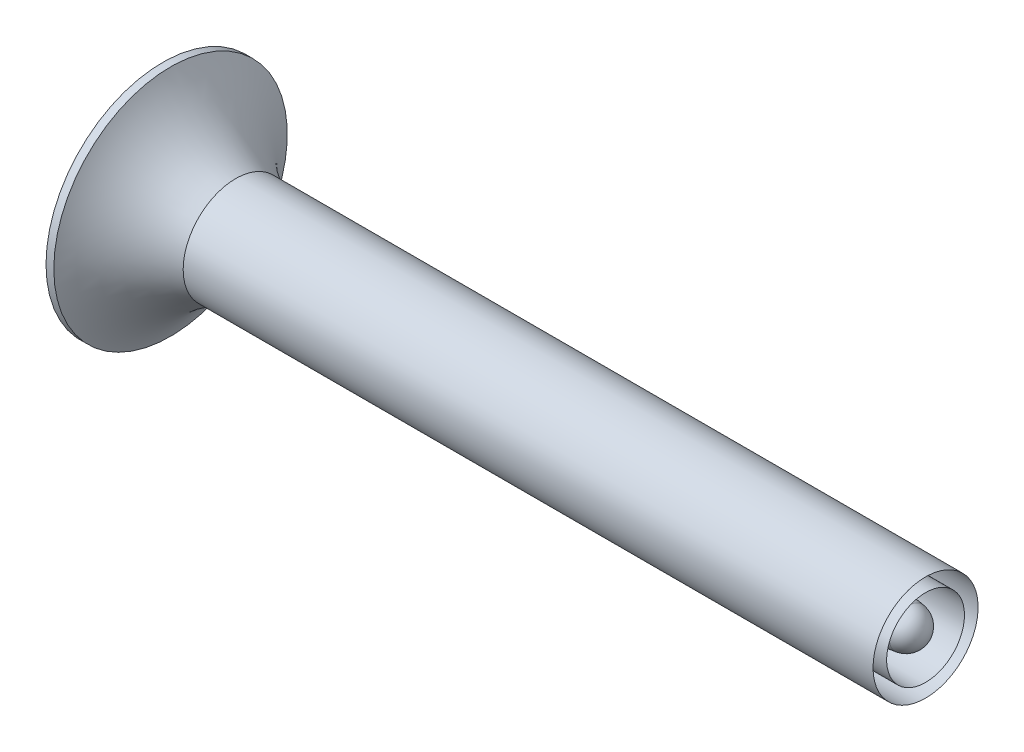
ISO-10303-21;
HEADER;
FILE_DESCRIPTION(('STEP AP214'),'2;1');
FILE_NAME('part.step','',(''),(''),'','','');
FILE_SCHEMA(('AUTOMOTIVE_DESIGN { 1 0 10303 214 1 1 1 1 }'));
ENDSEC;
DATA;
#1=APPLICATION_CONTEXT('core data for automotive mechanical design processes');
#2=APPLICATION_PROTOCOL_DEFINITION('international standard','automotive_design',2000,#1);
#3=PRODUCT_CONTEXT('',#1,'mechanical');
#4=PRODUCT('Part','Part','',(#3));
#5=PRODUCT_RELATED_PRODUCT_CATEGORY('part','',(#4));
#6=PRODUCT_DEFINITION_FORMATION('','',#4);
#7=PRODUCT_DEFINITION_CONTEXT('part definition',#1,'design');
#8=PRODUCT_DEFINITION('design','',#6,#7);
#9=PRODUCT_DEFINITION_SHAPE('','',#8);
#10=(LENGTH_UNIT() NAMED_UNIT(*) SI_UNIT(.MILLI.,.METRE.));
#11=(NAMED_UNIT(*) PLANE_ANGLE_UNIT() SI_UNIT($,.RADIAN.));
#12=(NAMED_UNIT(*) SI_UNIT($,.STERADIAN.) SOLID_ANGLE_UNIT());
#13=UNCERTAINTY_MEASURE_WITH_UNIT(LENGTH_MEASURE(1.E-05),#10,'distance_accuracy_value','');
#14=(GEOMETRIC_REPRESENTATION_CONTEXT(3) GLOBAL_UNCERTAINTY_ASSIGNED_CONTEXT((#13)) GLOBAL_UNIT_ASSIGNED_CONTEXT((#10,
#11,#12)) REPRESENTATION_CONTEXT('',''));
#15=CARTESIAN_POINT('',(0.,0.,0.));
#16=DIRECTION('',(0.,0.,1.));
#17=DIRECTION('',(1.,0.,0.));
#18=AXIS2_PLACEMENT_3D('',#15,#16,#17);
#19=CARTESIAN_POINT('',(0.,0.,0.));
#20=DIRECTION('',(1.,0.,0.));
#21=DIRECTION('',(0.,0.,-1.));
#22=AXIS2_PLACEMENT_3D('',#19,#20,#21);
#23=CYLINDRICAL_SURFACE('',#22,1.7145);
#24=CARTESIAN_POINT('',(0.,0.,0.));
#25=DIRECTION('',(-1.,0.,0.));
#26=DIRECTION('',(0.,0.,1.));
#27=AXIS2_PLACEMENT_3D('',#24,#25,#26);
#28=CIRCLE('',#27,1.7145);
#29=CARTESIAN_POINT('',(0.,0.,1.7145));
#30=VERTEX_POINT('',#29);
#31=EDGE_CURVE('E60',#30,#30,#28,.T.);
#32=ORIENTED_EDGE('',*,*,#31,.T.);
#33=EDGE_LOOP('',(#32));
#34=FACE_BOUND('',#33,.T.);
#35=CARTESIAN_POINT('',(24.892,0.,0.));
#36=DIRECTION('',(-1.,0.,0.));
#37=DIRECTION('',(0.,0.,1.));
#38=AXIS2_PLACEMENT_3D('',#35,#36,#37);
#39=CIRCLE('',#38,1.7145);
#40=CARTESIAN_POINT('',(24.892,0.,1.7145));
#41=VERTEX_POINT('',#40);
#42=EDGE_CURVE('E11',#41,#41,#39,.T.);
#43=ORIENTED_EDGE('',*,*,#42,.F.);
#44=EDGE_LOOP('',(#43));
#45=FACE_BOUND('',#44,.T.);
#46=ADVANCED_FACE('F56',(#34,#45),#23,.F.);
#47=OPEN_SHELL('',(#46));
#48=SHELL_BASED_SURFACE_MODEL('B2',(#47));
#49=CARTESIAN_POINT('',(0.,0.,0.));
#50=DIRECTION('',(1.,0.,0.));
#51=DIRECTION('',(0.,0.,-1.));
#52=AXIS2_PLACEMENT_3D('',#49,#50,#51);
#53=CYLINDRICAL_SURFACE('',#52,1.27);
#54=CARTESIAN_POINT('',(0.,0.,0.));
#55=DIRECTION('',(1.,0.,0.));
#56=DIRECTION('',(0.,0.,-1.));
#57=AXIS2_PLACEMENT_3D('',#54,#55,#56);
#58=CIRCLE('',#57,1.27);
#59=CARTESIAN_POINT('',(0.,0.,-1.27));
#60=VERTEX_POINT('',#59);
#61=EDGE_CURVE('E94',#60,#60,#58,.T.);
#62=ORIENTED_EDGE('',*,*,#61,.T.);
#63=EDGE_LOOP('',(#62));
#64=FACE_BOUND('',#63,.T.);
#65=CARTESIAN_POINT('',(24.892,0.,0.));
#66=DIRECTION('',(1.,0.,0.));
#67=DIRECTION('',(0.,0.,-1.));
#68=AXIS2_PLACEMENT_3D('',#65,#66,#67);
#69=CIRCLE('',#68,1.27);
#70=CARTESIAN_POINT('',(24.892,0.,-1.27));
#71=VERTEX_POINT('',#70);
#72=EDGE_CURVE('E55',#71,#71,#69,.T.);
#73=ORIENTED_EDGE('',*,*,#72,.F.);
#74=EDGE_LOOP('',(#73));
#75=FACE_BOUND('',#74,.T.);
#76=ADVANCED_FACE('F90',(#64,#75),#53,.T.);
#77=OPEN_SHELL('',(#76));
#78=SHELL_BASED_SURFACE_MODEL('B6',(#77));
#79=CARTESIAN_POINT('',(0.,0.,0.));
#80=DIRECTION('',(-1.,0.,0.));
#81=DIRECTION('',(0.,0.,1.));
#82=AXIS2_PLACEMENT_3D('',#79,#80,#81);
#83=CYLINDRICAL_SURFACE('',#82,3.81);
#84=CARTESIAN_POINT('',(0.254000000000002,0.,0.));
#85=DIRECTION('',(-1.,0.,0.));
#86=DIRECTION('',(0.,0.,1.));
#87=AXIS2_PLACEMENT_3D('',#84,#85,#86);
#88=CIRCLE('',#87,3.81);
#89=CARTESIAN_POINT('',(0.254000000000002,0.,3.81));
#90=VERTEX_POINT('',#89);
#91=EDGE_CURVE('E136',#90,#90,#88,.T.);
#92=ORIENTED_EDGE('',*,*,#91,.T.);
#93=EDGE_LOOP('',(#92));
#94=FACE_BOUND('',#93,.T.);
#95=CARTESIAN_POINT('',(0.,0.,0.));
#96=DIRECTION('',(-1.,0.,0.));
#97=DIRECTION('',(0.,0.,1.));
#98=AXIS2_PLACEMENT_3D('',#95,#96,#97);
#99=CIRCLE('',#98,3.81);
#100=CARTESIAN_POINT('',(0.,0.,3.81));
#101=VERTEX_POINT('',#100);
#102=EDGE_CURVE('E89',#101,#101,#99,.T.);
#103=ORIENTED_EDGE('',*,*,#102,.F.);
#104=EDGE_LOOP('',(#103));
#105=FACE_BOUND('',#104,.T.);
#106=ADVANCED_FACE('F117',(#94,#105),#83,.T.);
#107=CARTESIAN_POINT('',(0.,-3.81,0.));
#108=DIRECTION('',(-1.,0.,0.));
#109=DIRECTION('',(0.,0.,1.));
#110=AXIS2_PLACEMENT_3D('',#107,#108,#109);
#111=PLANE('',#110);
#112=ORIENTED_EDGE('',*,*,#102,.T.);
#113=EDGE_LOOP('',(#112));
#114=FACE_BOUND('',#113,.T.);
#115=ADVANCED_FACE('F154',(#114),#111,.T.);
#116=CARTESIAN_POINT('',(24.257,0.,0.));
#117=DIRECTION('',(-1.,0.,0.));
#118=DIRECTION('',(0.,-1.,0.));
#119=AXIS2_PLACEMENT_3D('',#116,#117,#118);
#120=SPHERICAL_SURFACE('',#119,0.635000000000001);
#121=CARTESIAN_POINT('',(24.3398841320597,0.,0.));
#122=DIRECTION('',(-1.,0.,0.));
#123=DIRECTION('',(0.,0.,1.));
#124=AXIS2_PLACEMENT_3D('',#121,#122,#123);
#125=CIRCLE('',#124,0.62956748697237);
#126=CARTESIAN_POINT('',(24.3398841320597,0.,0.62956748697237));
#127=VERTEX_POINT('',#126);
#128=EDGE_CURVE('E123',#127,#127,#125,.T.);
#129=ORIENTED_EDGE('',*,*,#128,.F.);
#130=EDGE_LOOP('',(#129));
#131=FACE_BOUND('',#130,.T.);
#132=ADVANCED_FACE('F158',(#131),#120,.T.);
#133=CARTESIAN_POINT('',(19.4753162373071,0.,0.));
#134=DIRECTION('',(-1.,0.,0.));
#135=DIRECTION('',(0.,0.,1.));
#136=AXIS2_PLACEMENT_3D('',#133,#134,#135);
#137=CONICAL_SURFACE('',#136,1.27,0.130899693899571);
#138=ORIENTED_EDGE('',*,*,#128,.T.);
#139=EDGE_LOOP('',(#138));
#140=FACE_BOUND('',#139,.T.);
#141=CARTESIAN_POINT('',(19.4753162373071,0.,0.));
#142=DIRECTION('',(-1.,0.,0.));
#143=DIRECTION('',(0.,0.,1.));
#144=AXIS2_PLACEMENT_3D('',#141,#142,#143);
#145=CIRCLE('',#144,1.27);
#146=CARTESIAN_POINT('',(19.4753162373071,0.,1.27));
#147=VERTEX_POINT('',#146);
#148=EDGE_CURVE('E127',#147,#147,#145,.T.);
#149=ORIENTED_EDGE('',*,*,#148,.F.);
#150=EDGE_LOOP('',(#149));
#151=FACE_BOUND('',#150,.T.);
#152=ADVANCED_FACE('F150',(#140,#151),#137,.T.);
#153=CARTESIAN_POINT('',(0.,0.,0.));
#154=DIRECTION('',(-1.,0.,0.));
#155=DIRECTION('',(0.,0.,1.));
#156=AXIS2_PLACEMENT_3D('',#153,#154,#155);
#157=CYLINDRICAL_SURFACE('',#156,1.27);
#158=ORIENTED_EDGE('',*,*,#148,.T.);
#159=EDGE_LOOP('',(#158));
#160=FACE_BOUND('',#159,.T.);
#161=CARTESIAN_POINT('',(4.318,0.,0.));
#162=DIRECTION('',(-1.,0.,0.));
#163=DIRECTION('',(0.,0.,1.));
#164=AXIS2_PLACEMENT_3D('',#161,#162,#163);
#165=CIRCLE('',#164,1.27);
#166=CARTESIAN_POINT('',(4.318,0.,1.27));
#167=VERTEX_POINT('',#166);
#168=EDGE_CURVE('E131',#167,#167,#165,.T.);
#169=ORIENTED_EDGE('',*,*,#168,.F.);
#170=EDGE_LOOP('',(#169));
#171=FACE_BOUND('',#170,.T.);
#172=ADVANCED_FACE('F144',(#160,#171),#157,.T.);
#173=CARTESIAN_POINT('',(4.318,0.,0.));
#174=DIRECTION('',(-1.,0.,0.));
#175=DIRECTION('',(0.,0.,1.));
#176=AXIS2_PLACEMENT_3D('',#173,#174,#175);
#177=TOROIDAL_SURFACE('',#176,5.7912,4.5212);
#178=ORIENTED_EDGE('',*,*,#168,.T.);
#179=EDGE_LOOP('',(#178));
#180=FACE_BOUND('',#179,.T.);
#181=ORIENTED_EDGE('',*,*,#91,.F.);
#182=EDGE_LOOP('',(#181));
#183=FACE_BOUND('',#182,.T.);
#184=ADVANCED_FACE('F142',(#180,#183),#177,.F.);
#185=CLOSED_SHELL('',(#106,#115,#132,#152,#172,#184));
#186=MANIFOLD_SOLID_BREP('B50',#185);
#187=ADVANCED_BREP_SHAPE_REPRESENTATION('',(#18,#186),#14);
#188=MANIFOLD_SURFACE_SHAPE_REPRESENTATION('',(#18,#48,#78),#14);
#189=SHAPE_REPRESENTATION('',(#18),#14);
#190=SHAPE_DEFINITION_REPRESENTATION(#9,#189);
#191=SHAPE_REPRESENTATION_RELATIONSHIP('','',#189,#187);
#192=SHAPE_REPRESENTATION_RELATIONSHIP('','',#189,#188);
ENDSEC;
END-ISO-10303-21;
